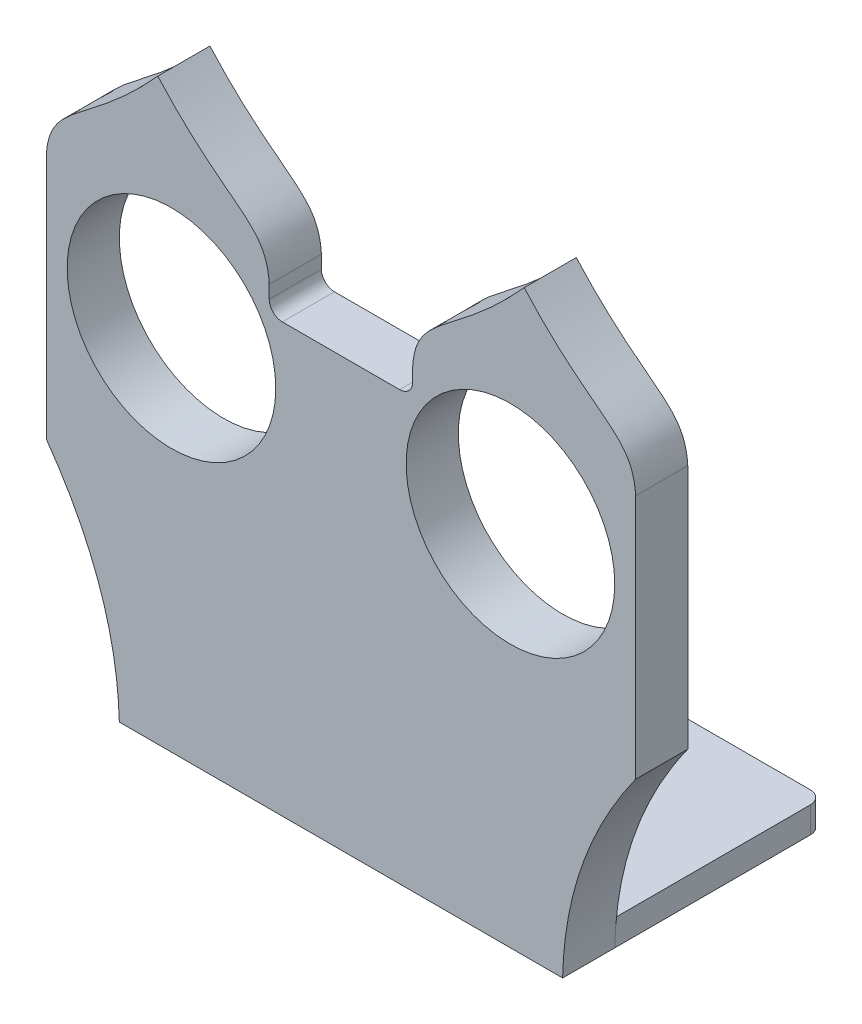
ISO-10303-21;
HEADER;
FILE_DESCRIPTION(('STEP AP214'),'2;1');
FILE_NAME('part.step','',(''),(''),'','','');
FILE_SCHEMA(('AUTOMOTIVE_DESIGN { 1 0 10303 214 1 1 1 1 }'));
ENDSEC;
DATA;
#1=APPLICATION_CONTEXT('core data for automotive mechanical design processes');
#2=APPLICATION_PROTOCOL_DEFINITION('international standard','automotive_design',2000,#1);
#3=PRODUCT_CONTEXT('',#1,'mechanical');
#4=PRODUCT('Part','Part','',(#3));
#5=PRODUCT_RELATED_PRODUCT_CATEGORY('part','',(#4));
#6=PRODUCT_DEFINITION_FORMATION('','',#4);
#7=PRODUCT_DEFINITION_CONTEXT('part definition',#1,'design');
#8=PRODUCT_DEFINITION('design','',#6,#7);
#9=PRODUCT_DEFINITION_SHAPE('','',#8);
#10=(LENGTH_UNIT() NAMED_UNIT(*) SI_UNIT(.MILLI.,.METRE.));
#11=(NAMED_UNIT(*) PLANE_ANGLE_UNIT() SI_UNIT($,.RADIAN.));
#12=(NAMED_UNIT(*) SI_UNIT($,.STERADIAN.) SOLID_ANGLE_UNIT());
#13=UNCERTAINTY_MEASURE_WITH_UNIT(LENGTH_MEASURE(1.E-05),#10,'distance_accuracy_value','');
#14=(GEOMETRIC_REPRESENTATION_CONTEXT(3) GLOBAL_UNCERTAINTY_ASSIGNED_CONTEXT((#13)) GLOBAL_UNIT_ASSIGNED_CONTEXT((#10,
#11,#12)) REPRESENTATION_CONTEXT('',''));
#15=CARTESIAN_POINT('',(0.,0.,0.));
#16=DIRECTION('',(0.,0.,1.));
#17=DIRECTION('',(1.,0.,0.));
#18=AXIS2_PLACEMENT_3D('',#15,#16,#17);
#19=CARTESIAN_POINT('',(0.,-16.,0.));
#20=DIRECTION('',(0.,-1.,0.));
#21=DIRECTION('',(0.,0.,-1.));
#22=AXIS2_PLACEMENT_3D('',#19,#20,#21);
#23=PLANE('',#22);
#24=CARTESIAN_POINT('',(22.6,-16.,-2.75000000000003));
#25=DIRECTION('',(0.,-1.,0.));
#26=DIRECTION('',(0.,0.,-1.));
#27=AXIS2_PLACEMENT_3D('',#24,#25,#26);
#28=CIRCLE('',#27,0.499999999999999);
#29=CARTESIAN_POINT('',(22.6,-16.,-3.25000000000003));
#30=VERTEX_POINT('',#29);
#31=EDGE_CURVE('E428',#30,#30,#28,.T.);
#32=ORIENTED_EDGE('',*,*,#31,.T.);
#33=EDGE_LOOP('',(#32));
#34=FACE_BOUND('',#33,.T.);
#35=CARTESIAN_POINT('',(28.85,-16.,-9.));
#36=DIRECTION('',(0.,-1.,0.));
#37=DIRECTION('',(0.,0.,-1.));
#38=AXIS2_PLACEMENT_3D('',#35,#36,#37);
#39=CIRCLE('',#38,0.499999999999999);
#40=CARTESIAN_POINT('',(28.85,-16.,-9.5));
#41=VERTEX_POINT('',#40);
#42=EDGE_CURVE('E443',#41,#41,#39,.T.);
#43=ORIENTED_EDGE('',*,*,#42,.T.);
#44=EDGE_LOOP('',(#43));
#45=FACE_BOUND('',#44,.T.);
#46=CARTESIAN_POINT('',(22.6,-16.,-15.25));
#47=DIRECTION('',(0.,-1.,0.));
#48=DIRECTION('',(0.,0.,-1.));
#49=AXIS2_PLACEMENT_3D('',#46,#47,#48);
#50=CIRCLE('',#49,0.499999999999999);
#51=CARTESIAN_POINT('',(22.6,-16.,-15.75));
#52=VERTEX_POINT('',#51);
#53=EDGE_CURVE('E447',#52,#52,#50,.T.);
#54=ORIENTED_EDGE('',*,*,#53,.T.);
#55=EDGE_LOOP('',(#54));
#56=FACE_BOUND('',#55,.T.);
#57=CARTESIAN_POINT('',(16.35,-16.,-9.));
#58=DIRECTION('',(0.,-1.,0.));
#59=DIRECTION('',(0.,0.,-1.));
#60=AXIS2_PLACEMENT_3D('',#57,#58,#59);
#61=CIRCLE('',#60,0.499999999999999);
#62=CARTESIAN_POINT('',(16.35,-16.,-9.5));
#63=VERTEX_POINT('',#62);
#64=EDGE_CURVE('E451',#63,#63,#61,.T.);
#65=ORIENTED_EDGE('',*,*,#64,.T.);
#66=EDGE_LOOP('',(#65));
#67=FACE_BOUND('',#66,.T.);
#68=DIRECTION('',(-1.,0.,0.));
#69=VECTOR('',#68,1.);
#70=CARTESIAN_POINT('',(0.,-16.,-2.));
#71=LINE('',#70,#69);
#72=CARTESIAN_POINT('',(39.6,-16.,-2.));
#73=VERTEX_POINT('',#72);
#74=CARTESIAN_POINT('',(5.6,-16.,-2.));
#75=VERTEX_POINT('',#74);
#76=EDGE_CURVE('E403',#73,#75,#71,.T.);
#77=ORIENTED_EDGE('',*,*,#76,.F.);
#78=DIRECTION('',(0.,0.,1.));
#79=VECTOR('',#78,1.);
#80=CARTESIAN_POINT('',(39.6,-16.,0.));
#81=LINE('',#80,#79);
#82=CARTESIAN_POINT('',(39.6,-16.,-17.));
#83=VERTEX_POINT('',#82);
#84=EDGE_CURVE('E292',#83,#73,#81,.T.);
#85=ORIENTED_EDGE('',*,*,#84,.F.);
#86=CARTESIAN_POINT('',(38.6,-16.,-17.));
#87=DIRECTION('',(0.,-1.,0.));
#88=DIRECTION('',(0.,0.,-1.));
#89=AXIS2_PLACEMENT_3D('',#86,#87,#88);
#90=CIRCLE('',#89,1.);
#91=CARTESIAN_POINT('',(38.6,-16.,-18.));
#92=VERTEX_POINT('',#91);
#93=EDGE_CURVE('E379',#92,#83,#90,.T.);
#94=ORIENTED_EDGE('',*,*,#93,.F.);
#95=DIRECTION('',(-1.,0.,0.));
#96=VECTOR('',#95,1.);
#97=CARTESIAN_POINT('',(45.2,-16.,-18.));
#98=LINE('',#97,#96);
#99=CARTESIAN_POINT('',(6.60000000000001,-16.,-18.));
#100=VERTEX_POINT('',#99);
#101=EDGE_CURVE('E311',#92,#100,#98,.T.);
#102=ORIENTED_EDGE('',*,*,#101,.T.);
#103=CARTESIAN_POINT('',(6.6,-16.,-17.));
#104=DIRECTION('',(0.,-1.,0.));
#105=DIRECTION('',(0.,0.,-1.));
#106=AXIS2_PLACEMENT_3D('',#103,#104,#105);
#107=CIRCLE('',#106,1.);
#108=CARTESIAN_POINT('',(5.6,-16.,-17.));
#109=VERTEX_POINT('',#108);
#110=EDGE_CURVE('E385',#109,#100,#107,.T.);
#111=ORIENTED_EDGE('',*,*,#110,.F.);
#112=DIRECTION('',(0.,0.,-1.));
#113=VECTOR('',#112,1.);
#114=CARTESIAN_POINT('',(5.6,-16.,0.));
#115=LINE('',#114,#113);
#116=EDGE_CURVE('E382',#75,#109,#115,.T.);
#117=ORIENTED_EDGE('',*,*,#116,.F.);
#118=EDGE_LOOP('',(#77,#85,#94,#102,#111,#117));
#119=FACE_BOUND('',#118,.T.);
#120=ADVANCED_FACE('F41',(#34,#45,#56,#67,#119),#23,.F.);
#121=CARTESIAN_POINT('',(39.6,2.,0.));
#122=DIRECTION('',(1.,0.,0.));
#123=DIRECTION('',(0.,0.,-1.));
#124=AXIS2_PLACEMENT_3D('',#121,#122,#123);
#125=PLANE('',#124);
#126=ORIENTED_EDGE('',*,*,#84,.T.);
#127=DIRECTION('',(0.,-1.,0.));
#128=VECTOR('',#127,1.);
#129=CARTESIAN_POINT('',(39.6,2.,-2.));
#130=LINE('',#129,#128);
#131=CARTESIAN_POINT('',(39.6,-18.,-2.));
#132=VERTEX_POINT('',#131);
#133=EDGE_CURVE('E396',#73,#132,#130,.T.);
#134=ORIENTED_EDGE('',*,*,#133,.T.);
#135=DIRECTION('',(0.,0.,1.));
#136=VECTOR('',#135,1.);
#137=CARTESIAN_POINT('',(39.6,-18.,-18.));
#138=LINE('',#137,#136);
#139=CARTESIAN_POINT('',(39.6,-18.,-17.));
#140=VERTEX_POINT('',#139);
#141=EDGE_CURVE('E304',#140,#132,#138,.T.);
#142=ORIENTED_EDGE('',*,*,#141,.F.);
#143=DIRECTION('',(0.,-1.,0.));
#144=VECTOR('',#143,1.);
#145=CARTESIAN_POINT('',(39.6,2.,-17.));
#146=LINE('',#145,#144);
#147=EDGE_CURVE('E340',#83,#140,#146,.T.);
#148=ORIENTED_EDGE('',*,*,#147,.F.);
#149=EDGE_LOOP('',(#126,#134,#142,#148));
#150=FACE_BOUND('',#149,.T.);
#151=ADVANCED_FACE('F271',(#150),#125,.T.);
#152=CARTESIAN_POINT('',(5.6,2.,0.));
#153=DIRECTION('',(-1.,0.,0.));
#154=DIRECTION('',(0.,0.,1.));
#155=AXIS2_PLACEMENT_3D('',#152,#153,#154);
#156=PLANE('',#155);
#157=DIRECTION('',(0.,0.,-1.));
#158=VECTOR('',#157,1.);
#159=CARTESIAN_POINT('',(5.6,-18.,0.));
#160=LINE('',#159,#158);
#161=CARTESIAN_POINT('',(5.6,-18.,-2.));
#162=VERTEX_POINT('',#161);
#163=CARTESIAN_POINT('',(5.6,-18.,-17.));
#164=VERTEX_POINT('',#163);
#165=EDGE_CURVE('E362',#162,#164,#160,.T.);
#166=ORIENTED_EDGE('',*,*,#165,.F.);
#167=DIRECTION('',(0.,1.,0.));
#168=VECTOR('',#167,1.);
#169=CARTESIAN_POINT('',(5.6,2.,-2.));
#170=LINE('',#169,#168);
#171=EDGE_CURVE('E11',#162,#75,#170,.T.);
#172=ORIENTED_EDGE('',*,*,#171,.T.);
#173=ORIENTED_EDGE('',*,*,#116,.T.);
#174=DIRECTION('',(0.,-1.,0.));
#175=VECTOR('',#174,1.);
#176=CARTESIAN_POINT('',(5.6,2.,-17.));
#177=LINE('',#176,#175);
#178=EDGE_CURVE('E365',#109,#164,#177,.T.);
#179=ORIENTED_EDGE('',*,*,#178,.T.);
#180=EDGE_LOOP('',(#166,#172,#173,#179));
#181=FACE_BOUND('',#180,.T.);
#182=ADVANCED_FACE('F267',(#181),#156,.T.);
#183=CARTESIAN_POINT('',(0.,0.,2.));
#184=DIRECTION('',(0.,0.,1.));
#185=DIRECTION('',(1.,0.,0.));
#186=AXIS2_PLACEMENT_3D('',#183,#184,#185);
#187=PLANE('',#186);
#188=CARTESIAN_POINT('',(36.65,26.379999999999,2.));
#189=CARTESIAN_POINT('',(30.8893641511686,19.9456020579826,2.));
#190=CARTESIAN_POINT('',(27.8650437209988,20.8402807928677,2.));
#191=CARTESIAN_POINT('',(28.1,15.8299999999989,2.));
#192=B_SPLINE_CURVE_WITH_KNOTS('',3,(#188,#189,#190,#191),.UNSPECIFIED.,.F.,.F.,(4,4),(0.,1.),.UNSPECIFIED.);
#193=CARTESIAN_POINT('',(36.65,26.379999999999,2.));
#194=VERTEX_POINT('',#193);
#195=CARTESIAN_POINT('',(28.1,16.829999999999,2.));
#196=VERTEX_POINT('',#195);
#197=EDGE_CURVE('E197',#194,#196,#192,.T.);
#198=ORIENTED_EDGE('',*,*,#197,.T.);
#199=DIRECTION('',(0.,-1.,0.));
#200=VECTOR('',#199,1.);
#201=CARTESIAN_POINT('',(28.1,0.,2.));
#202=LINE('',#201,#200);
#203=CARTESIAN_POINT('',(28.1,15.83,2.));
#204=VERTEX_POINT('',#203);
#205=EDGE_CURVE('E420',#196,#204,#202,.T.);
#206=ORIENTED_EDGE('',*,*,#205,.T.);
#207=CARTESIAN_POINT('',(27.1,15.83,2.));
#208=DIRECTION('',(0.,0.,1.));
#209=DIRECTION('',(1.,0.,0.));
#210=AXIS2_PLACEMENT_3D('',#207,#208,#209);
#211=CIRCLE('',#210,1.);
#212=CARTESIAN_POINT('',(27.1,14.83,2.));
#213=VERTEX_POINT('',#212);
#214=EDGE_CURVE('E351',#204,#213,#211,.F.);
#215=ORIENTED_EDGE('',*,*,#214,.T.);
#216=DIRECTION('',(-1.,0.,0.));
#217=VECTOR('',#216,1.);
#218=CARTESIAN_POINT('',(0.,14.83,2.));
#219=LINE('',#218,#217);
#220=CARTESIAN_POINT('',(18.1,14.83,2.));
#221=VERTEX_POINT('',#220);
#222=EDGE_CURVE('E417',#213,#221,#219,.T.);
#223=ORIENTED_EDGE('',*,*,#222,.T.);
#224=CARTESIAN_POINT('',(18.1,15.83,2.));
#225=DIRECTION('',(0.,0.,1.));
#226=DIRECTION('',(1.,0.,0.));
#227=AXIS2_PLACEMENT_3D('',#224,#225,#226);
#228=CIRCLE('',#227,1.);
#229=CARTESIAN_POINT('',(17.1,15.83,2.));
#230=VERTEX_POINT('',#229);
#231=EDGE_CURVE('E51',#221,#230,#228,.F.);
#232=ORIENTED_EDGE('',*,*,#231,.T.);
#233=DIRECTION('',(0.,1.,0.));
#234=VECTOR('',#233,1.);
#235=CARTESIAN_POINT('',(17.1,0.,2.));
#236=LINE('',#235,#234);
#237=CARTESIAN_POINT('',(17.1,16.829999999999,2.));
#238=VERTEX_POINT('',#237);
#239=EDGE_CURVE('E409',#230,#238,#236,.T.);
#240=ORIENTED_EDGE('',*,*,#239,.T.);
#241=CARTESIAN_POINT('',(8.55000000000001,26.379999999999,2.));
#242=CARTESIAN_POINT('',(14.3106336937528,19.9456057460835,2.));
#243=CARTESIAN_POINT('',(17.3349564471281,20.8402805051428,2.));
#244=CARTESIAN_POINT('',(17.1,15.83,2.));
#245=B_SPLINE_CURVE_WITH_KNOTS('',3,(#241,#242,#243,#244),.UNSPECIFIED.,.F.,.F.,(4,4),(0.,1.),.UNSPECIFIED.);
#246=CARTESIAN_POINT('',(8.55000000000001,26.379999999999,2.));
#247=VERTEX_POINT('',#246);
#248=EDGE_CURVE('E525',#247,#238,#245,.T.);
#249=ORIENTED_EDGE('',*,*,#248,.F.);
#250=CARTESIAN_POINT('',(8.55000000000001,26.379999999999,2.));
#251=CARTESIAN_POINT('',(2.78936415116862,19.9456020579826,2.));
#252=CARTESIAN_POINT('',(-0.234956279001187,20.8402807928676,2.));
#253=CARTESIAN_POINT('',(0.,15.8299999999989,2.));
#254=B_SPLINE_CURVE_WITH_KNOTS('',3,(#250,#251,#252,#253),.UNSPECIFIED.,.F.,.F.,(4,4),(0.,1.),.UNSPECIFIED.);
#255=CARTESIAN_POINT('',(0.,16.829999999999,2.));
#256=VERTEX_POINT('',#255);
#257=EDGE_CURVE('E180',#247,#256,#254,.T.);
#258=ORIENTED_EDGE('',*,*,#257,.T.);
#259=DIRECTION('',(0.,-1.,0.));
#260=VECTOR('',#259,1.);
#261=CARTESIAN_POINT('',(0.,0.,2.));
#262=LINE('',#261,#260);
#263=CARTESIAN_POINT('',(0.,-2.00000000000001,2.));
#264=VERTEX_POINT('',#263);
#265=EDGE_CURVE('E344',#256,#264,#262,.T.);
#266=ORIENTED_EDGE('',*,*,#265,.T.);
#267=CARTESIAN_POINT('',(0.,-2.00000000000001,2.));
#268=CARTESIAN_POINT('',(5.82336854832193,-10.1623478121815,2.));
#269=CARTESIAN_POINT('',(5.6,-19.3523127660924,2.));
#270=B_SPLINE_CURVE_WITH_KNOTS('',2,(#267,#268,#269),.UNSPECIFIED.,.F.,.F.,(3,3),(0.,1.),.UNSPECIFIED.);
#271=CARTESIAN_POINT('',(5.6,-18.,2.));
#272=VERTEX_POINT('',#271);
#273=EDGE_CURVE('E294',#264,#272,#270,.T.);
#274=ORIENTED_EDGE('',*,*,#273,.T.);
#275=DIRECTION('',(-1.,0.,0.));
#276=VECTOR('',#275,1.);
#277=CARTESIAN_POINT('',(45.2,-18.,2.));
#278=LINE('',#277,#276);
#279=CARTESIAN_POINT('',(39.6,-18.,2.));
#280=VERTEX_POINT('',#279);
#281=EDGE_CURVE('E468',#280,#272,#278,.T.);
#282=ORIENTED_EDGE('',*,*,#281,.F.);
#283=CARTESIAN_POINT('',(45.2,-2.00000000000001,2.));
#284=CARTESIAN_POINT('',(39.4089842105638,-10.0699113582224,2.));
#285=CARTESIAN_POINT('',(39.6,-19.1564434318099,2.));
#286=B_SPLINE_CURVE_WITH_KNOTS('',2,(#283,#284,#285),.UNSPECIFIED.,.F.,.F.,(3,3),(0.,1.),.UNSPECIFIED.);
#287=CARTESIAN_POINT('',(45.2,-2.00000000000001,2.));
#288=VERTEX_POINT('',#287);
#289=EDGE_CURVE('E316',#288,#280,#286,.T.);
#290=ORIENTED_EDGE('',*,*,#289,.F.);
#291=DIRECTION('',(0.,1.,0.));
#292=VECTOR('',#291,1.);
#293=CARTESIAN_POINT('',(45.2,0.,2.));
#294=LINE('',#293,#292);
#295=CARTESIAN_POINT('',(45.2,16.829999999999,2.));
#296=VERTEX_POINT('',#295);
#297=EDGE_CURVE('E483',#288,#296,#294,.T.);
#298=ORIENTED_EDGE('',*,*,#297,.T.);
#299=CARTESIAN_POINT('',(36.65,26.379999999999,2.));
#300=CARTESIAN_POINT('',(42.4106336937528,19.9456057460835,2.));
#301=CARTESIAN_POINT('',(45.4349564471281,20.8402805051438,2.));
#302=CARTESIAN_POINT('',(45.2,15.8299999999998,2.));
#303=B_SPLINE_CURVE_WITH_KNOTS('',3,(#299,#300,#301,#302),.UNSPECIFIED.,.F.,.F.,(4,4),(0.,1.),.UNSPECIFIED.);
#304=EDGE_CURVE('E509',#194,#296,#303,.T.);
#305=ORIENTED_EDGE('',*,*,#304,.F.);
#306=EDGE_LOOP('',(#198,#206,#215,#223,#232,#240,#249,#258,#266,#274,#282,#290,#298,#305));
#307=FACE_BOUND('',#306,.T.);
#308=CARTESIAN_POINT('',(9.6,10.165,2.));
#309=DIRECTION('',(0.,0.,1.));
#310=DIRECTION('',(1.,0.,0.));
#311=AXIS2_PLACEMENT_3D('',#308,#309,#310);
#312=CIRCLE('',#311,8.);
#313=CARTESIAN_POINT('',(17.6,10.165,2.));
#314=VERTEX_POINT('',#313);
#315=EDGE_CURVE('E479',#314,#314,#312,.T.);
#316=ORIENTED_EDGE('',*,*,#315,.F.);
#317=EDGE_LOOP('',(#316));
#318=FACE_BOUND('',#317,.T.);
#319=CARTESIAN_POINT('',(35.6,10.165,2.));
#320=DIRECTION('',(0.,0.,1.));
#321=DIRECTION('',(1.,0.,0.));
#322=AXIS2_PLACEMENT_3D('',#319,#320,#321);
#323=CIRCLE('',#322,8.);
#324=CARTESIAN_POINT('',(43.6,10.165,2.));
#325=VERTEX_POINT('',#324);
#326=EDGE_CURVE('E473',#325,#325,#323,.T.);
#327=ORIENTED_EDGE('',*,*,#326,.F.);
#328=EDGE_LOOP('',(#327));
#329=FACE_BOUND('',#328,.T.);
#330=ADVANCED_FACE('F270',(#307,#318,#329),#187,.T.);
#331=CARTESIAN_POINT('',(0.,0.,2.));
#332=DIRECTION('',(1.,0.,0.));
#333=DIRECTION('',(0.,0.,-1.));
#334=AXIS2_PLACEMENT_3D('',#331,#332,#333);
#335=PLANE('',#334);
#336=DIRECTION('',(0.,-1.,0.));
#337=VECTOR('',#336,1.);
#338=CARTESIAN_POINT('',(0.,0.,-2.));
#339=LINE('',#338,#337);
#340=CARTESIAN_POINT('',(0.,16.829999999999,-2.));
#341=VERTEX_POINT('',#340);
#342=CARTESIAN_POINT('',(0.,-2.00000000000001,-2.));
#343=VERTEX_POINT('',#342);
#344=EDGE_CURVE('E204',#341,#343,#339,.T.);
#345=ORIENTED_EDGE('',*,*,#344,.T.);
#346=DIRECTION('',(0.,0.,1.));
#347=VECTOR('',#346,1.);
#348=CARTESIAN_POINT('',(0.,-2.00000000000001,-18.));
#349=LINE('',#348,#347);
#350=EDGE_CURVE('E305',#343,#264,#349,.T.);
#351=ORIENTED_EDGE('',*,*,#350,.T.);
#352=ORIENTED_EDGE('',*,*,#265,.F.);
#353=DIRECTION('',(0.,0.,1.));
#354=VECTOR('',#353,1.);
#355=CARTESIAN_POINT('',(0.,16.829999999999,-2.));
#356=LINE('',#355,#354);
#357=EDGE_CURVE('E185',#341,#256,#356,.T.);
#358=ORIENTED_EDGE('',*,*,#357,.F.);
#359=EDGE_LOOP('',(#345,#351,#352,#358));
#360=FACE_BOUND('',#359,.T.);
#361=ADVANCED_FACE('F492',(#360),#335,.F.);
#362=CARTESIAN_POINT('',(45.2,0.,2.));
#363=DIRECTION('',(-1.,0.,0.));
#364=DIRECTION('',(0.,0.,1.));
#365=AXIS2_PLACEMENT_3D('',#362,#363,#364);
#366=PLANE('',#365);
#367=DIRECTION('',(0.,0.,1.));
#368=VECTOR('',#367,1.);
#369=CARTESIAN_POINT('',(45.2,-2.00000000000001,-18.));
#370=LINE('',#369,#368);
#371=CARTESIAN_POINT('',(45.2,-2.00000000000001,-2.));
#372=VERTEX_POINT('',#371);
#373=EDGE_CURVE('E325',#372,#288,#370,.T.);
#374=ORIENTED_EDGE('',*,*,#373,.F.);
#375=DIRECTION('',(0.,1.,0.));
#376=VECTOR('',#375,1.);
#377=CARTESIAN_POINT('',(45.2,0.,-2.));
#378=LINE('',#377,#376);
#379=CARTESIAN_POINT('',(45.2,16.829999999999,-2.));
#380=VERTEX_POINT('',#379);
#381=EDGE_CURVE('E628',#372,#380,#378,.T.);
#382=ORIENTED_EDGE('',*,*,#381,.T.);
#383=DIRECTION('',(0.,0.,1.));
#384=VECTOR('',#383,1.);
#385=CARTESIAN_POINT('',(45.2,16.829999999999,-2.));
#386=LINE('',#385,#384);
#387=EDGE_CURVE('E494',#380,#296,#386,.T.);
#388=ORIENTED_EDGE('',*,*,#387,.T.);
#389=ORIENTED_EDGE('',*,*,#297,.F.);
#390=EDGE_LOOP('',(#374,#382,#388,#389));
#391=FACE_BOUND('',#390,.T.);
#392=ADVANCED_FACE('F596',(#391),#366,.F.);
#393=CARTESIAN_POINT('',(9.6,10.165,2.));
#394=DIRECTION('',(0.,0.,-1.));
#395=DIRECTION('',(-1.,0.,0.));
#396=AXIS2_PLACEMENT_3D('',#393,#394,#395);
#397=CYLINDRICAL_SURFACE('',#396,8.);
#398=ORIENTED_EDGE('',*,*,#315,.T.);
#399=EDGE_LOOP('',(#398));
#400=FACE_BOUND('',#399,.T.);
#401=CARTESIAN_POINT('',(9.6,10.165,-2.));
#402=DIRECTION('',(0.,0.,1.));
#403=DIRECTION('',(1.,0.,0.));
#404=AXIS2_PLACEMENT_3D('',#401,#402,#403);
#405=CIRCLE('',#404,8.);
#406=CARTESIAN_POINT('',(17.6,10.165,-2.));
#407=VERTEX_POINT('',#406);
#408=EDGE_CURVE('E539',#407,#407,#405,.F.);
#409=ORIENTED_EDGE('',*,*,#408,.T.);
#410=EDGE_LOOP('',(#409));
#411=FACE_BOUND('',#410,.T.);
#412=ADVANCED_FACE('F599',(#400,#411),#397,.F.);
#413=CARTESIAN_POINT('',(35.6,10.165,2.));
#414=DIRECTION('',(0.,0.,-1.));
#415=DIRECTION('',(-1.,0.,0.));
#416=AXIS2_PLACEMENT_3D('',#413,#414,#415);
#417=CYLINDRICAL_SURFACE('',#416,8.);
#418=ORIENTED_EDGE('',*,*,#326,.T.);
#419=EDGE_LOOP('',(#418));
#420=FACE_BOUND('',#419,.T.);
#421=CARTESIAN_POINT('',(35.6,10.165,-2.));
#422=DIRECTION('',(0.,0.,1.));
#423=DIRECTION('',(1.,0.,0.));
#424=AXIS2_PLACEMENT_3D('',#421,#422,#423);
#425=CIRCLE('',#424,8.);
#426=CARTESIAN_POINT('',(43.6,10.165,-2.));
#427=VERTEX_POINT('',#426);
#428=EDGE_CURVE('E186',#427,#427,#425,.F.);
#429=ORIENTED_EDGE('',*,*,#428,.T.);
#430=EDGE_LOOP('',(#429));
#431=FACE_BOUND('',#430,.T.);
#432=ADVANCED_FACE('F244',(#420,#431),#417,.F.);
#433=CARTESIAN_POINT('',(17.1,0.,-18.));
#434=DIRECTION('',(1.,0.,0.));
#435=DIRECTION('',(0.,0.,-1.));
#436=AXIS2_PLACEMENT_3D('',#433,#434,#435);
#437=PLANE('',#436);
#438=DIRECTION('',(0.,0.,1.));
#439=VECTOR('',#438,1.);
#440=CARTESIAN_POINT('',(17.1,15.83,0.));
#441=LINE('',#440,#439);
#442=CARTESIAN_POINT('',(17.1,15.83,-2.));
#443=VERTEX_POINT('',#442);
#444=EDGE_CURVE('E357',#230,#443,#441,.F.);
#445=ORIENTED_EDGE('',*,*,#444,.T.);
#446=DIRECTION('',(0.,1.,0.));
#447=VECTOR('',#446,1.);
#448=CARTESIAN_POINT('',(17.1,0.,-2.));
#449=LINE('',#448,#447);
#450=CARTESIAN_POINT('',(17.1,16.829999999999,-2.));
#451=VERTEX_POINT('',#450);
#452=EDGE_CURVE('E543',#443,#451,#449,.T.);
#453=ORIENTED_EDGE('',*,*,#452,.T.);
#454=DIRECTION('',(0.,0.,1.));
#455=VECTOR('',#454,1.);
#456=CARTESIAN_POINT('',(17.1,16.829999999999,-2.));
#457=LINE('',#456,#455);
#458=EDGE_CURVE('E192',#451,#238,#457,.T.);
#459=ORIENTED_EDGE('',*,*,#458,.T.);
#460=ORIENTED_EDGE('',*,*,#239,.F.);
#461=EDGE_LOOP('',(#445,#453,#459,#460));
#462=FACE_BOUND('',#461,.T.);
#463=ADVANCED_FACE('F234',(#462),#437,.T.);
#464=CARTESIAN_POINT('',(28.1,0.,-18.));
#465=DIRECTION('',(-1.,0.,0.));
#466=DIRECTION('',(0.,0.,1.));
#467=AXIS2_PLACEMENT_3D('',#464,#465,#466);
#468=PLANE('',#467);
#469=DIRECTION('',(0.,-1.,0.));
#470=VECTOR('',#469,1.);
#471=CARTESIAN_POINT('',(28.1,0.,-2.));
#472=LINE('',#471,#470);
#473=CARTESIAN_POINT('',(28.1,16.829999999999,-2.));
#474=VERTEX_POINT('',#473);
#475=CARTESIAN_POINT('',(28.1,15.83,-2.));
#476=VERTEX_POINT('',#475);
#477=EDGE_CURVE('E558',#474,#476,#472,.T.);
#478=ORIENTED_EDGE('',*,*,#477,.T.);
#479=DIRECTION('',(0.,0.,1.));
#480=VECTOR('',#479,1.);
#481=CARTESIAN_POINT('',(28.1,15.83,2.));
#482=LINE('',#481,#480);
#483=EDGE_CURVE('E343',#476,#204,#482,.T.);
#484=ORIENTED_EDGE('',*,*,#483,.T.);
#485=ORIENTED_EDGE('',*,*,#205,.F.);
#486=DIRECTION('',(0.,0.,1.));
#487=VECTOR('',#486,1.);
#488=CARTESIAN_POINT('',(28.1,16.829999999999,-2.));
#489=LINE('',#488,#487);
#490=EDGE_CURVE('E411',#474,#196,#489,.T.);
#491=ORIENTED_EDGE('',*,*,#490,.F.);
#492=EDGE_LOOP('',(#478,#484,#485,#491));
#493=FACE_BOUND('',#492,.T.);
#494=ADVANCED_FACE('F230',(#493),#468,.T.);
#495=CARTESIAN_POINT('',(0.,0.,-18.));
#496=DIRECTION('',(0.,0.,1.));
#497=DIRECTION('',(1.,0.,0.));
#498=AXIS2_PLACEMENT_3D('',#495,#496,#497);
#499=PLANE('',#498);
#500=ORIENTED_EDGE('',*,*,#101,.F.);
#501=DIRECTION('',(0.,-1.,0.));
#502=VECTOR('',#501,1.);
#503=CARTESIAN_POINT('',(38.6,2.,-18.));
#504=LINE('',#503,#502);
#505=CARTESIAN_POINT('',(38.6,-18.,-18.));
#506=VERTEX_POINT('',#505);
#507=EDGE_CURVE('E383',#92,#506,#504,.T.);
#508=ORIENTED_EDGE('',*,*,#507,.T.);
#509=DIRECTION('',(-1.,0.,0.));
#510=VECTOR('',#509,1.);
#511=CARTESIAN_POINT('',(45.2,-18.,-18.));
#512=LINE('',#511,#510);
#513=CARTESIAN_POINT('',(6.60000000000001,-18.,-18.));
#514=VERTEX_POINT('',#513);
#515=EDGE_CURVE('E462',#506,#514,#512,.T.);
#516=ORIENTED_EDGE('',*,*,#515,.T.);
#517=DIRECTION('',(0.,-1.,0.));
#518=VECTOR('',#517,1.);
#519=CARTESIAN_POINT('',(6.60000000000001,2.,-18.));
#520=LINE('',#519,#518);
#521=EDGE_CURVE('E372',#100,#514,#520,.T.);
#522=ORIENTED_EDGE('',*,*,#521,.F.);
#523=EDGE_LOOP('',(#500,#508,#516,#522));
#524=FACE_BOUND('',#523,.T.);
#525=ADVANCED_FACE('F233',(#524),#499,.F.);
#526=CARTESIAN_POINT('',(0.,-18.,0.));
#527=DIRECTION('',(0.,-1.,0.));
#528=DIRECTION('',(0.,0.,-1.));
#529=AXIS2_PLACEMENT_3D('',#526,#527,#528);
#530=PLANE('',#529);
#531=DIRECTION('',(0.,0.,1.));
#532=VECTOR('',#531,1.);
#533=CARTESIAN_POINT('',(5.6,-18.,-18.));
#534=LINE('',#533,#532);
#535=EDGE_CURVE('E303',#162,#272,#534,.T.);
#536=ORIENTED_EDGE('',*,*,#535,.F.);
#537=ORIENTED_EDGE('',*,*,#165,.T.);
#538=CARTESIAN_POINT('',(6.6,-18.,-17.));
#539=DIRECTION('',(0.,-1.,0.));
#540=DIRECTION('',(0.,0.,-1.));
#541=AXIS2_PLACEMENT_3D('',#538,#539,#540);
#542=CIRCLE('',#541,1.);
#543=EDGE_CURVE('E366',#164,#514,#542,.T.);
#544=ORIENTED_EDGE('',*,*,#543,.T.);
#545=ORIENTED_EDGE('',*,*,#515,.F.);
#546=CARTESIAN_POINT('',(38.6,-18.,-17.));
#547=DIRECTION('',(0.,-1.,0.));
#548=DIRECTION('',(0.,0.,-1.));
#549=AXIS2_PLACEMENT_3D('',#546,#547,#548);
#550=CIRCLE('',#549,1.);
#551=EDGE_CURVE('E375',#506,#140,#550,.T.);
#552=ORIENTED_EDGE('',*,*,#551,.T.);
#553=ORIENTED_EDGE('',*,*,#141,.T.);
#554=EDGE_CURVE('E334',#132,#280,#138,.T.);
#555=ORIENTED_EDGE('',*,*,#554,.T.);
#556=ORIENTED_EDGE('',*,*,#281,.T.);
#557=EDGE_LOOP('',(#536,#537,#544,#545,#552,#553,#555,#556));
#558=FACE_BOUND('',#557,.T.);
#559=CARTESIAN_POINT('',(16.35,-18.,-9.));
#560=DIRECTION('',(0.,-1.,0.));
#561=DIRECTION('',(0.,0.,-1.));
#562=AXIS2_PLACEMENT_3D('',#559,#560,#561);
#563=CIRCLE('',#562,0.499999999999999);
#564=CARTESIAN_POINT('',(16.35,-18.,-9.5));
#565=VERTEX_POINT('',#564);
#566=EDGE_CURVE('E424',#565,#565,#563,.T.);
#567=ORIENTED_EDGE('',*,*,#566,.F.);
#568=EDGE_LOOP('',(#567));
#569=FACE_BOUND('',#568,.T.);
#570=CARTESIAN_POINT('',(22.6,-18.,-15.25));
#571=DIRECTION('',(0.,-1.,0.));
#572=DIRECTION('',(0.,0.,-1.));
#573=AXIS2_PLACEMENT_3D('',#570,#571,#572);
#574=CIRCLE('',#573,0.499999999999999);
#575=CARTESIAN_POINT('',(22.6,-18.,-15.75));
#576=VERTEX_POINT('',#575);
#577=EDGE_CURVE('E429',#576,#576,#574,.T.);
#578=ORIENTED_EDGE('',*,*,#577,.F.);
#579=EDGE_LOOP('',(#578));
#580=FACE_BOUND('',#579,.T.);
#581=CARTESIAN_POINT('',(28.85,-18.,-9.));
#582=DIRECTION('',(0.,-1.,0.));
#583=DIRECTION('',(0.,0.,-1.));
#584=AXIS2_PLACEMENT_3D('',#581,#582,#583);
#585=CIRCLE('',#584,0.499999999999999);
#586=CARTESIAN_POINT('',(28.85,-18.,-9.5));
#587=VERTEX_POINT('',#586);
#588=EDGE_CURVE('E433',#587,#587,#585,.T.);
#589=ORIENTED_EDGE('',*,*,#588,.F.);
#590=EDGE_LOOP('',(#589));
#591=FACE_BOUND('',#590,.T.);
#592=CARTESIAN_POINT('',(22.6,-18.,-2.75000000000003));
#593=DIRECTION('',(0.,-1.,0.));
#594=DIRECTION('',(0.,0.,-1.));
#595=AXIS2_PLACEMENT_3D('',#592,#593,#594);
#596=CIRCLE('',#595,0.499999999999999);
#597=CARTESIAN_POINT('',(22.6,-18.,-3.25000000000003));
#598=VERTEX_POINT('',#597);
#599=EDGE_CURVE('E423',#598,#598,#596,.T.);
#600=ORIENTED_EDGE('',*,*,#599,.F.);
#601=EDGE_LOOP('',(#600));
#602=FACE_BOUND('',#601,.T.);
#603=ADVANCED_FACE('F283',(#558,#569,#580,#591,#602),#530,.T.);
#604=CARTESIAN_POINT('',(0.,-2.00000000000001,-18.));
#605=CARTESIAN_POINT('',(5.82336854832193,-10.1623478121815,-18.));
#606=CARTESIAN_POINT('',(5.6,-19.3523127660924,-18.));
#607=B_SPLINE_CURVE_WITH_KNOTS('',2,(#604,#605,#606),.UNSPECIFIED.,.F.,.F.,(3,3),(0.,1.),.UNSPECIFIED.);
#608=DIRECTION('',(0.,0.,1.));
#609=VECTOR('',#608,1.);
#610=SURFACE_OF_LINEAR_EXTRUSION('',#607,#609);
#611=ORIENTED_EDGE('',*,*,#350,.F.);
#612=CARTESIAN_POINT('',(0.,-2.00000000000001,-2.));
#613=CARTESIAN_POINT('',(5.82336854832193,-10.1623478121815,-2.));
#614=CARTESIAN_POINT('',(5.6,-19.3523127660924,-2.));
#615=B_SPLINE_CURVE_WITH_KNOTS('',2,(#612,#613,#614),.UNSPECIFIED.,.F.,.F.,(3,3),(0.,1.),.UNSPECIFIED.);
#616=EDGE_CURVE('E208',#343,#162,#615,.T.);
#617=ORIENTED_EDGE('',*,*,#616,.T.);
#618=ORIENTED_EDGE('',*,*,#535,.T.);
#619=ORIENTED_EDGE('',*,*,#273,.F.);
#620=EDGE_LOOP('',(#611,#617,#618,#619));
#621=FACE_BOUND('',#620,.T.);
#622=ADVANCED_FACE('F279',(#621),#610,.T.);
#623=CARTESIAN_POINT('',(45.2,-2.00000000000001,-18.));
#624=CARTESIAN_POINT('',(39.4089842105638,-10.0699113582224,-18.));
#625=CARTESIAN_POINT('',(39.6,-19.1564434318099,-18.));
#626=B_SPLINE_CURVE_WITH_KNOTS('',2,(#623,#624,#625),.UNSPECIFIED.,.F.,.F.,(3,3),(0.,1.),.UNSPECIFIED.);
#627=DIRECTION('',(0.,0.,1.));
#628=VECTOR('',#627,1.);
#629=SURFACE_OF_LINEAR_EXTRUSION('',#626,#628);
#630=ORIENTED_EDGE('',*,*,#554,.F.);
#631=CARTESIAN_POINT('',(39.6,-19.1564434318099,-2.));
#632=CARTESIAN_POINT('',(39.4089842105638,-10.0699113582224,-2.));
#633=CARTESIAN_POINT('',(45.2,-2.00000000000001,-2.));
#634=B_SPLINE_CURVE_WITH_KNOTS('',2,(#631,#632,#633),.UNSPECIFIED.,.F.,.F.,(3,3),(0.,1.),.UNSPECIFIED.);
#635=EDGE_CURVE('E630',#132,#372,#634,.T.);
#636=ORIENTED_EDGE('',*,*,#635,.T.);
#637=ORIENTED_EDGE('',*,*,#373,.T.);
#638=ORIENTED_EDGE('',*,*,#289,.T.);
#639=EDGE_LOOP('',(#630,#636,#637,#638));
#640=FACE_BOUND('',#639,.T.);
#641=ADVANCED_FACE('F265',(#640),#629,.F.);
#642=CARTESIAN_POINT('',(38.6,2.,-17.));
#643=DIRECTION('',(0.,-1.,0.));
#644=DIRECTION('',(0.,0.,-1.));
#645=AXIS2_PLACEMENT_3D('',#642,#643,#644);
#646=CYLINDRICAL_SURFACE('',#645,1.);
#647=ORIENTED_EDGE('',*,*,#93,.T.);
#648=ORIENTED_EDGE('',*,*,#147,.T.);
#649=ORIENTED_EDGE('',*,*,#551,.F.);
#650=ORIENTED_EDGE('',*,*,#507,.F.);
#651=EDGE_LOOP('',(#647,#648,#649,#650));
#652=FACE_BOUND('',#651,.T.);
#653=ADVANCED_FACE('F262',(#652),#646,.T.);
#654=CARTESIAN_POINT('',(6.6,2.,-17.));
#655=DIRECTION('',(0.,-1.,0.));
#656=DIRECTION('',(0.,0.,-1.));
#657=AXIS2_PLACEMENT_3D('',#654,#655,#656);
#658=CYLINDRICAL_SURFACE('',#657,1.);
#659=ORIENTED_EDGE('',*,*,#110,.T.);
#660=ORIENTED_EDGE('',*,*,#521,.T.);
#661=ORIENTED_EDGE('',*,*,#543,.F.);
#662=ORIENTED_EDGE('',*,*,#178,.F.);
#663=EDGE_LOOP('',(#659,#660,#661,#662));
#664=FACE_BOUND('',#663,.T.);
#665=ADVANCED_FACE('F260',(#664),#658,.T.);
#666=CARTESIAN_POINT('',(22.6,2.,-2.75000000000003));
#667=DIRECTION('',(0.,-1.,0.));
#668=DIRECTION('',(0.,0.,-1.));
#669=AXIS2_PLACEMENT_3D('',#666,#667,#668);
#670=CYLINDRICAL_SURFACE('',#669,0.499999999999999);
#671=ORIENTED_EDGE('',*,*,#599,.T.);
#672=EDGE_LOOP('',(#671));
#673=FACE_BOUND('',#672,.T.);
#674=ORIENTED_EDGE('',*,*,#31,.F.);
#675=EDGE_LOOP('',(#674));
#676=FACE_BOUND('',#675,.T.);
#677=ADVANCED_FACE('F256',(#673,#676),#670,.F.);
#678=CARTESIAN_POINT('',(28.85,2.,-9.));
#679=DIRECTION('',(0.,-1.,0.));
#680=DIRECTION('',(0.,0.,-1.));
#681=AXIS2_PLACEMENT_3D('',#678,#679,#680);
#682=CYLINDRICAL_SURFACE('',#681,0.499999999999999);
#683=ORIENTED_EDGE('',*,*,#588,.T.);
#684=EDGE_LOOP('',(#683));
#685=FACE_BOUND('',#684,.T.);
#686=ORIENTED_EDGE('',*,*,#42,.F.);
#687=EDGE_LOOP('',(#686));
#688=FACE_BOUND('',#687,.T.);
#689=ADVANCED_FACE('F252',(#685,#688),#682,.F.);
#690=CARTESIAN_POINT('',(22.6,2.,-15.25));
#691=DIRECTION('',(0.,-1.,0.));
#692=DIRECTION('',(0.,0.,-1.));
#693=AXIS2_PLACEMENT_3D('',#690,#691,#692);
#694=CYLINDRICAL_SURFACE('',#693,0.499999999999999);
#695=ORIENTED_EDGE('',*,*,#577,.T.);
#696=EDGE_LOOP('',(#695));
#697=FACE_BOUND('',#696,.T.);
#698=ORIENTED_EDGE('',*,*,#53,.F.);
#699=EDGE_LOOP('',(#698));
#700=FACE_BOUND('',#699,.T.);
#701=ADVANCED_FACE('F248',(#697,#700),#694,.F.);
#702=CARTESIAN_POINT('',(16.35,2.,-9.));
#703=DIRECTION('',(0.,-1.,0.));
#704=DIRECTION('',(0.,0.,-1.));
#705=AXIS2_PLACEMENT_3D('',#702,#703,#704);
#706=CYLINDRICAL_SURFACE('',#705,0.499999999999999);
#707=ORIENTED_EDGE('',*,*,#566,.T.);
#708=EDGE_LOOP('',(#707));
#709=FACE_BOUND('',#708,.T.);
#710=ORIENTED_EDGE('',*,*,#64,.F.);
#711=EDGE_LOOP('',(#710));
#712=FACE_BOUND('',#711,.T.);
#713=ADVANCED_FACE('F240',(#709,#712),#706,.F.);
#714=CARTESIAN_POINT('',(0.,14.83,-18.));
#715=DIRECTION('',(0.,1.,0.));
#716=DIRECTION('',(-1.,0.,0.));
#717=AXIS2_PLACEMENT_3D('',#714,#715,#716);
#718=PLANE('',#717);
#719=DIRECTION('',(0.,0.,1.));
#720=VECTOR('',#719,1.);
#721=CARTESIAN_POINT('',(27.1,14.83,0.));
#722=LINE('',#721,#720);
#723=CARTESIAN_POINT('',(27.1,14.83,-2.));
#724=VERTEX_POINT('',#723);
#725=EDGE_CURVE('E348',#213,#724,#722,.F.);
#726=ORIENTED_EDGE('',*,*,#725,.T.);
#727=DIRECTION('',(-1.,0.,0.));
#728=VECTOR('',#727,1.);
#729=CARTESIAN_POINT('',(0.,14.83,-2.));
#730=LINE('',#729,#728);
#731=CARTESIAN_POINT('',(18.1,14.83,-2.));
#732=VERTEX_POINT('',#731);
#733=EDGE_CURVE('E550',#724,#732,#730,.T.);
#734=ORIENTED_EDGE('',*,*,#733,.T.);
#735=DIRECTION('',(0.,0.,1.));
#736=VECTOR('',#735,1.);
#737=CARTESIAN_POINT('',(18.1,14.83,2.));
#738=LINE('',#737,#736);
#739=EDGE_CURVE('E354',#732,#221,#738,.T.);
#740=ORIENTED_EDGE('',*,*,#739,.T.);
#741=ORIENTED_EDGE('',*,*,#222,.F.);
#742=EDGE_LOOP('',(#726,#734,#740,#741));
#743=FACE_BOUND('',#742,.T.);
#744=ADVANCED_FACE('F236',(#743),#718,.T.);
#745=CARTESIAN_POINT('',(27.1,15.83,-18.));
#746=DIRECTION('',(0.,0.,-1.));
#747=DIRECTION('',(-1.,0.,0.));
#748=AXIS2_PLACEMENT_3D('',#745,#746,#747);
#749=CYLINDRICAL_SURFACE('',#748,1.);
#750=ORIENTED_EDGE('',*,*,#483,.F.);
#751=CARTESIAN_POINT('',(27.1,15.83,-2.));
#752=DIRECTION('',(0.,0.,1.));
#753=DIRECTION('',(1.,0.,0.));
#754=AXIS2_PLACEMENT_3D('',#751,#752,#753);
#755=CIRCLE('',#754,1.);
#756=EDGE_CURVE('E554',#476,#724,#755,.F.);
#757=ORIENTED_EDGE('',*,*,#756,.T.);
#758=ORIENTED_EDGE('',*,*,#725,.F.);
#759=ORIENTED_EDGE('',*,*,#214,.F.);
#760=EDGE_LOOP('',(#750,#757,#758,#759));
#761=FACE_BOUND('',#760,.T.);
#762=ADVANCED_FACE('F239',(#761),#749,.F.);
#763=CARTESIAN_POINT('',(18.1,15.83,-18.));
#764=DIRECTION('',(0.,0.,-1.));
#765=DIRECTION('',(-1.,0.,0.));
#766=AXIS2_PLACEMENT_3D('',#763,#764,#765);
#767=CYLINDRICAL_SURFACE('',#766,1.);
#768=ORIENTED_EDGE('',*,*,#739,.F.);
#769=CARTESIAN_POINT('',(18.1,15.83,-2.));
#770=DIRECTION('',(0.,0.,1.));
#771=DIRECTION('',(1.,0.,0.));
#772=AXIS2_PLACEMENT_3D('',#769,#770,#771);
#773=CIRCLE('',#772,1.);
#774=EDGE_CURVE('E546',#732,#443,#773,.F.);
#775=ORIENTED_EDGE('',*,*,#774,.T.);
#776=ORIENTED_EDGE('',*,*,#444,.F.);
#777=ORIENTED_EDGE('',*,*,#231,.F.);
#778=EDGE_LOOP('',(#768,#775,#776,#777));
#779=FACE_BOUND('',#778,.T.);
#780=ADVANCED_FACE('F43',(#779),#767,.F.);
#781=CARTESIAN_POINT('',(8.55000000000001,26.379999999999,-2.));
#782=CARTESIAN_POINT('',(14.3106336937528,19.9456057460835,-2.));
#783=CARTESIAN_POINT('',(17.3349564471281,20.8402805051428,-2.));
#784=CARTESIAN_POINT('',(17.1,15.83,-2.));
#785=B_SPLINE_CURVE_WITH_KNOTS('',3,(#781,#782,#783,#784),.UNSPECIFIED.,.F.,.F.,(4,4),(0.,1.),.UNSPECIFIED.);
#786=DIRECTION('',(0.,0.,1.));
#787=VECTOR('',#786,1.);
#788=SURFACE_OF_LINEAR_EXTRUSION('',#785,#787);
#789=ORIENTED_EDGE('',*,*,#248,.T.);
#790=ORIENTED_EDGE('',*,*,#458,.F.);
#791=CARTESIAN_POINT('',(8.55000000000001,26.379999999999,-2.));
#792=VERTEX_POINT('',#791);
#793=EDGE_CURVE('E189',#792,#451,#785,.T.);
#794=ORIENTED_EDGE('',*,*,#793,.F.);
#795=DIRECTION('',(0.,0.,1.));
#796=VECTOR('',#795,1.);
#797=CARTESIAN_POINT('',(8.55000000000001,26.379999999999,-2.));
#798=LINE('',#797,#796);
#799=EDGE_CURVE('E173',#792,#247,#798,.T.);
#800=ORIENTED_EDGE('',*,*,#799,.T.);
#801=EDGE_LOOP('',(#789,#790,#794,#800));
#802=FACE_BOUND('',#801,.T.);
#803=ADVANCED_FACE('F190',(#802),#788,.F.);
#804=CARTESIAN_POINT('',(36.65,26.379999999999,-2.));
#805=CARTESIAN_POINT('',(30.8893641511686,19.9456020579826,-2.));
#806=CARTESIAN_POINT('',(27.8650437209988,20.8402807928677,-2.));
#807=CARTESIAN_POINT('',(28.1,15.8299999999989,-2.));
#808=B_SPLINE_CURVE_WITH_KNOTS('',3,(#804,#805,#806,#807),.UNSPECIFIED.,.F.,.F.,(4,4),(0.,1.),.UNSPECIFIED.);
#809=DIRECTION('',(0.,0.,1.));
#810=VECTOR('',#809,1.);
#811=SURFACE_OF_LINEAR_EXTRUSION('',#808,#810);
#812=ORIENTED_EDGE('',*,*,#197,.F.);
#813=DIRECTION('',(0.,0.,1.));
#814=VECTOR('',#813,1.);
#815=CARTESIAN_POINT('',(36.65,26.379999999999,-2.));
#816=LINE('',#815,#814);
#817=CARTESIAN_POINT('',(36.65,26.379999999999,-2.));
#818=VERTEX_POINT('',#817);
#819=EDGE_CURVE('E497',#818,#194,#816,.T.);
#820=ORIENTED_EDGE('',*,*,#819,.F.);
#821=EDGE_CURVE('E562',#818,#474,#808,.T.);
#822=ORIENTED_EDGE('',*,*,#821,.T.);
#823=ORIENTED_EDGE('',*,*,#490,.T.);
#824=EDGE_LOOP('',(#812,#820,#822,#823));
#825=FACE_BOUND('',#824,.T.);
#826=ADVANCED_FACE('F229',(#825),#811,.T.);
#827=CARTESIAN_POINT('',(36.65,26.379999999999,-2.));
#828=CARTESIAN_POINT('',(42.4106336937528,19.9456057460835,-2.));
#829=CARTESIAN_POINT('',(45.4349564471281,20.8402805051438,-2.));
#830=CARTESIAN_POINT('',(45.2,15.8299999999998,-2.));
#831=B_SPLINE_CURVE_WITH_KNOTS('',3,(#827,#828,#829,#830),.UNSPECIFIED.,.F.,.F.,(4,4),(0.,1.),.UNSPECIFIED.);
#832=DIRECTION('',(0.,0.,1.));
#833=VECTOR('',#832,1.);
#834=SURFACE_OF_LINEAR_EXTRUSION('',#831,#833);
#835=ORIENTED_EDGE('',*,*,#304,.T.);
#836=ORIENTED_EDGE('',*,*,#387,.F.);
#837=EDGE_CURVE('E568',#818,#380,#831,.T.);
#838=ORIENTED_EDGE('',*,*,#837,.F.);
#839=ORIENTED_EDGE('',*,*,#819,.T.);
#840=EDGE_LOOP('',(#835,#836,#838,#839));
#841=FACE_BOUND('',#840,.T.);
#842=ADVANCED_FACE('F224',(#841),#834,.F.);
#843=CARTESIAN_POINT('',(8.55000000000001,26.379999999999,-2.));
#844=CARTESIAN_POINT('',(2.78936415116862,19.9456020579826,-2.));
#845=CARTESIAN_POINT('',(-0.234956279001187,20.8402807928676,-2.));
#846=CARTESIAN_POINT('',(0.,15.8299999999989,-2.));
#847=B_SPLINE_CURVE_WITH_KNOTS('',3,(#843,#844,#845,#846),.UNSPECIFIED.,.F.,.F.,(4,4),(0.,1.),.UNSPECIFIED.);
#848=DIRECTION('',(0.,0.,1.));
#849=VECTOR('',#848,1.);
#850=SURFACE_OF_LINEAR_EXTRUSION('',#847,#849);
#851=ORIENTED_EDGE('',*,*,#257,.F.);
#852=ORIENTED_EDGE('',*,*,#799,.F.);
#853=EDGE_CURVE('E178',#792,#341,#847,.T.);
#854=ORIENTED_EDGE('',*,*,#853,.T.);
#855=ORIENTED_EDGE('',*,*,#357,.T.);
#856=EDGE_LOOP('',(#851,#852,#854,#855));
#857=FACE_BOUND('',#856,.T.);
#858=ADVANCED_FACE('F175',(#857),#850,.T.);
#859=CARTESIAN_POINT('',(0.,0.,-2.));
#860=DIRECTION('',(0.,0.,1.));
#861=DIRECTION('',(1.,0.,0.));
#862=AXIS2_PLACEMENT_3D('',#859,#860,#861);
#863=PLANE('',#862);
#864=ORIENTED_EDGE('',*,*,#133,.F.);
#865=ORIENTED_EDGE('',*,*,#76,.T.);
#866=ORIENTED_EDGE('',*,*,#171,.F.);
#867=ORIENTED_EDGE('',*,*,#616,.F.);
#868=ORIENTED_EDGE('',*,*,#344,.F.);
#869=ORIENTED_EDGE('',*,*,#853,.F.);
#870=ORIENTED_EDGE('',*,*,#793,.T.);
#871=ORIENTED_EDGE('',*,*,#452,.F.);
#872=ORIENTED_EDGE('',*,*,#774,.F.);
#873=ORIENTED_EDGE('',*,*,#733,.F.);
#874=ORIENTED_EDGE('',*,*,#756,.F.);
#875=ORIENTED_EDGE('',*,*,#477,.F.);
#876=ORIENTED_EDGE('',*,*,#821,.F.);
#877=ORIENTED_EDGE('',*,*,#837,.T.);
#878=ORIENTED_EDGE('',*,*,#381,.F.);
#879=ORIENTED_EDGE('',*,*,#635,.F.);
#880=EDGE_LOOP('',(#864,#865,#866,#867,#868,#869,#870,#871,#872,#873,#874,#875,#876,#877,#878,#879));
#881=FACE_BOUND('',#880,.T.);
#882=ORIENTED_EDGE('',*,*,#408,.F.);
#883=EDGE_LOOP('',(#882));
#884=FACE_BOUND('',#883,.T.);
#885=ORIENTED_EDGE('',*,*,#428,.F.);
#886=EDGE_LOOP('',(#885));
#887=FACE_BOUND('',#886,.T.);
#888=ADVANCED_FACE('F200',(#881,#884,#887),#863,.F.);
#889=CLOSED_SHELL('',(#120,#151,#182,#330,#361,#392,#412,#432,#463,#494,#525,#603,#622,#641,
#653,#665,#677,#689,#701,#713,#744,#762,#780,#803,#826,#842,#858,#888));
#890=MANIFOLD_SOLID_BREP('B2',#889);
#891=ADVANCED_BREP_SHAPE_REPRESENTATION('',(#18,#890),#14);
#892=SHAPE_DEFINITION_REPRESENTATION(#9,#891);
ENDSEC;
END-ISO-10303-21;
